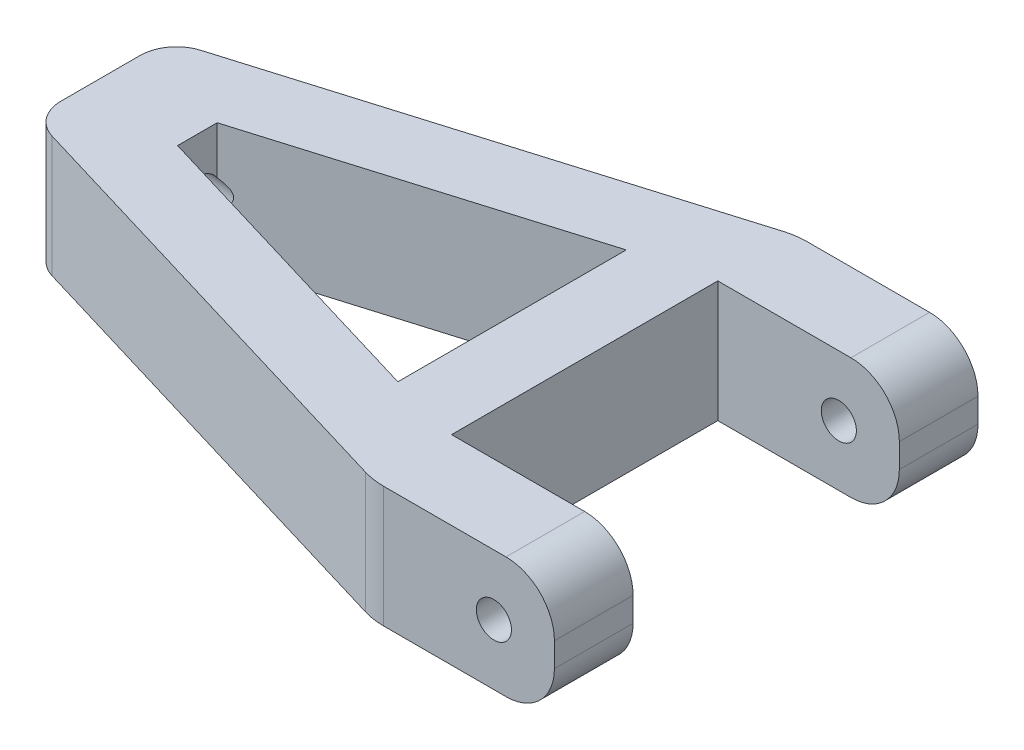
ISO-10303-21;
HEADER;
FILE_DESCRIPTION(('STEP AP214'),'2;1');
FILE_NAME('part.step','',(''),(''),'','','');
FILE_SCHEMA(('AUTOMOTIVE_DESIGN { 1 0 10303 214 1 1 1 1 }'));
ENDSEC;
DATA;
#1=APPLICATION_CONTEXT('core data for automotive mechanical design processes');
#2=APPLICATION_PROTOCOL_DEFINITION('international standard','automotive_design',2000,#1);
#3=PRODUCT_CONTEXT('',#1,'mechanical');
#4=PRODUCT('Part','Part','',(#3));
#5=PRODUCT_RELATED_PRODUCT_CATEGORY('part','',(#4));
#6=PRODUCT_DEFINITION_FORMATION('','',#4);
#7=PRODUCT_DEFINITION_CONTEXT('part definition',#1,'design');
#8=PRODUCT_DEFINITION('design','',#6,#7);
#9=PRODUCT_DEFINITION_SHAPE('','',#8);
#10=(LENGTH_UNIT() NAMED_UNIT(*) SI_UNIT(.MILLI.,.METRE.));
#11=(NAMED_UNIT(*) PLANE_ANGLE_UNIT() SI_UNIT($,.RADIAN.));
#12=(NAMED_UNIT(*) SI_UNIT($,.STERADIAN.) SOLID_ANGLE_UNIT());
#13=UNCERTAINTY_MEASURE_WITH_UNIT(LENGTH_MEASURE(1.E-05),#10,'distance_accuracy_value','');
#14=(GEOMETRIC_REPRESENTATION_CONTEXT(3) GLOBAL_UNCERTAINTY_ASSIGNED_CONTEXT((#13)) GLOBAL_UNIT_ASSIGNED_CONTEXT((#10,
#11,#12)) REPRESENTATION_CONTEXT('',''));
#15=CARTESIAN_POINT('',(0.,0.,0.));
#16=DIRECTION('',(0.,0.,1.));
#17=DIRECTION('',(1.,0.,0.));
#18=AXIS2_PLACEMENT_3D('',#15,#16,#17);
#19=CARTESIAN_POINT('',(55.,10.,0.));
#20=DIRECTION('',(-1.,0.,0.));
#21=DIRECTION('',(0.,0.,1.));
#22=AXIS2_PLACEMENT_3D('',#19,#20,#21);
#23=PLANE('',#22);
#24=DIRECTION('',(0.,-1.,0.));
#25=VECTOR('',#24,1.);
#26=CARTESIAN_POINT('',(55.,10.,28.5));
#27=LINE('',#26,#25);
#28=CARTESIAN_POINT('',(55.,6.,28.5));
#29=VERTEX_POINT('',#28);
#30=CARTESIAN_POINT('',(55.,4.,28.5));
#31=VERTEX_POINT('',#30);
#32=EDGE_CURVE('E229',#29,#31,#27,.T.);
#33=ORIENTED_EDGE('',*,*,#32,.F.);
#34=DIRECTION('',(0.,0.,-1.));
#35=VECTOR('',#34,1.);
#36=CARTESIAN_POINT('',(55.,6.,35.));
#37=LINE('',#36,#35);
#38=CARTESIAN_POINT('',(55.,6.,35.));
#39=VERTEX_POINT('',#38);
#40=EDGE_CURVE('E323',#29,#39,#37,.F.);
#41=ORIENTED_EDGE('',*,*,#40,.T.);
#42=DIRECTION('',(0.,-1.,0.));
#43=VECTOR('',#42,1.);
#44=CARTESIAN_POINT('',(55.,10.,35.));
#45=LINE('',#44,#43);
#46=CARTESIAN_POINT('',(55.,4.,35.));
#47=VERTEX_POINT('',#46);
#48=EDGE_CURVE('E303',#39,#47,#45,.T.);
#49=ORIENTED_EDGE('',*,*,#48,.T.);
#50=DIRECTION('',(0.,0.,-1.));
#51=VECTOR('',#50,1.);
#52=CARTESIAN_POINT('',(55.,4.,0.));
#53=LINE('',#52,#51);
#54=EDGE_CURVE('E320',#47,#31,#53,.T.);
#55=ORIENTED_EDGE('',*,*,#54,.T.);
#56=EDGE_LOOP('',(#33,#41,#49,#55));
#57=FACE_BOUND('',#56,.T.);
#58=ADVANCED_FACE('F33',(#57),#23,.F.);
#59=CARTESIAN_POINT('',(50.,5.,0.));
#60=DIRECTION('',(0.,0.,1.));
#61=DIRECTION('',(1.,0.,0.));
#62=AXIS2_PLACEMENT_3D('',#59,#60,#61);
#63=CYLINDRICAL_SURFACE('',#62,1.45);
#64=CARTESIAN_POINT('',(50.,5.,28.5));
#65=DIRECTION('',(0.,0.,1.));
#66=DIRECTION('',(1.,0.,0.));
#67=AXIS2_PLACEMENT_3D('',#64,#65,#66);
#68=CIRCLE('',#67,1.45);
#69=CARTESIAN_POINT('',(51.45,5.,28.5));
#70=VERTEX_POINT('',#69);
#71=EDGE_CURVE('E268',#70,#70,#68,.F.);
#72=ORIENTED_EDGE('',*,*,#71,.T.);
#73=EDGE_LOOP('',(#72));
#74=FACE_BOUND('',#73,.T.);
#75=CARTESIAN_POINT('',(50.,5.,35.));
#76=DIRECTION('',(0.,0.,1.));
#77=DIRECTION('',(1.,0.,0.));
#78=AXIS2_PLACEMENT_3D('',#75,#76,#77);
#79=CIRCLE('',#78,1.45);
#80=CARTESIAN_POINT('',(51.45,5.,35.));
#81=VERTEX_POINT('',#80);
#82=EDGE_CURVE('E267',#81,#81,#79,.T.);
#83=ORIENTED_EDGE('',*,*,#82,.T.);
#84=EDGE_LOOP('',(#83));
#85=FACE_BOUND('',#84,.T.);
#86=ADVANCED_FACE('F412',(#74,#85),#63,.F.);
#87=CARTESIAN_POINT('',(0.,10.,0.));
#88=DIRECTION('',(1.,0.,0.));
#89=DIRECTION('',(0.,0.,-1.));
#90=AXIS2_PLACEMENT_3D('',#87,#88,#89);
#91=PLANE('',#90);
#92=CARTESIAN_POINT('',(0.,5.,17.5));
#93=DIRECTION('',(-1.,0.,0.));
#94=DIRECTION('',(0.,0.,1.));
#95=AXIS2_PLACEMENT_3D('',#92,#93,#94);
#96=CIRCLE('',#95,1.95);
#97=CARTESIAN_POINT('',(0.,5.,19.45));
#98=VERTEX_POINT('',#97);
#99=EDGE_CURVE('E264',#98,#98,#96,.T.);
#100=ORIENTED_EDGE('',*,*,#99,.F.);
#101=EDGE_LOOP('',(#100));
#102=FACE_BOUND('',#101,.T.);
#103=DIRECTION('',(0.,0.,1.));
#104=VECTOR('',#103,1.);
#105=CARTESIAN_POINT('',(0.,10.,0.));
#106=LINE('',#105,#104);
#107=CARTESIAN_POINT('',(0.,10.,14.2320919526732));
#108=VERTEX_POINT('',#107);
#109=CARTESIAN_POINT('',(0.,10.,20.7679080473268));
#110=VERTEX_POINT('',#109);
#111=EDGE_CURVE('E285',#108,#110,#106,.T.);
#112=ORIENTED_EDGE('',*,*,#111,.F.);
#113=DIRECTION('',(0.,-1.,0.));
#114=VECTOR('',#113,1.);
#115=CARTESIAN_POINT('',(0.,10.,14.2320919526732));
#116=LINE('',#115,#114);
#117=CARTESIAN_POINT('',(0.,0.,14.2320919526732));
#118=VERTEX_POINT('',#117);
#119=EDGE_CURVE('E350',#108,#118,#116,.T.);
#120=ORIENTED_EDGE('',*,*,#119,.T.);
#121=DIRECTION('',(0.,0.,1.));
#122=VECTOR('',#121,1.);
#123=CARTESIAN_POINT('',(0.,0.,0.));
#124=LINE('',#123,#122);
#125=CARTESIAN_POINT('',(0.,0.,20.7679080473268));
#126=VERTEX_POINT('',#125);
#127=EDGE_CURVE('E283',#118,#126,#124,.T.);
#128=ORIENTED_EDGE('',*,*,#127,.T.);
#129=DIRECTION('',(0.,-1.,0.));
#130=VECTOR('',#129,1.);
#131=CARTESIAN_POINT('',(0.,10.,20.7679080473268));
#132=LINE('',#131,#130);
#133=EDGE_CURVE('E348',#126,#110,#132,.F.);
#134=ORIENTED_EDGE('',*,*,#133,.T.);
#135=EDGE_LOOP('',(#112,#120,#128,#134));
#136=FACE_BOUND('',#135,.T.);
#137=ADVANCED_FACE('F419',(#102,#136),#91,.F.);
#138=CARTESIAN_POINT('',(0.,10.,35.));
#139=DIRECTION('',(0.,0.,-1.));
#140=DIRECTION('',(-1.,0.,0.));
#141=AXIS2_PLACEMENT_3D('',#138,#139,#140);
#142=PLANE('',#141);
#143=ORIENTED_EDGE('',*,*,#82,.F.);
#144=EDGE_LOOP('',(#143));
#145=FACE_BOUND('',#144,.T.);
#146=DIRECTION('',(1.,0.,0.));
#147=VECTOR('',#146,1.);
#148=CARTESIAN_POINT('',(0.,10.,35.));
#149=LINE('',#148,#147);
#150=CARTESIAN_POINT('',(40.8806130178211,10.,35.));
#151=VERTEX_POINT('',#150);
#152=CARTESIAN_POINT('',(51.,10.,35.));
#153=VERTEX_POINT('',#152);
#154=EDGE_CURVE('E288',#151,#153,#149,.T.);
#155=ORIENTED_EDGE('',*,*,#154,.F.);
#156=DIRECTION('',(0.,-1.,0.));
#157=VECTOR('',#156,1.);
#158=CARTESIAN_POINT('',(40.8806130178211,10.,35.));
#159=LINE('',#158,#157);
#160=CARTESIAN_POINT('',(40.8806130178211,0.,35.));
#161=VERTEX_POINT('',#160);
#162=EDGE_CURVE('E368',#151,#161,#159,.T.);
#163=ORIENTED_EDGE('',*,*,#162,.T.);
#164=DIRECTION('',(1.,0.,0.));
#165=VECTOR('',#164,1.);
#166=CARTESIAN_POINT('',(0.,0.,35.));
#167=LINE('',#166,#165);
#168=CARTESIAN_POINT('',(51.,0.,35.));
#169=VERTEX_POINT('',#168);
#170=EDGE_CURVE('E297',#161,#169,#167,.T.);
#171=ORIENTED_EDGE('',*,*,#170,.T.);
#172=CARTESIAN_POINT('',(51.,4.,35.));
#173=DIRECTION('',(0.,0.,-1.));
#174=DIRECTION('',(-1.,0.,0.));
#175=AXIS2_PLACEMENT_3D('',#172,#173,#174);
#176=CIRCLE('',#175,4.);
#177=EDGE_CURVE('E325',#169,#47,#176,.F.);
#178=ORIENTED_EDGE('',*,*,#177,.T.);
#179=ORIENTED_EDGE('',*,*,#48,.F.);
#180=CARTESIAN_POINT('',(51.,6.,35.));
#181=DIRECTION('',(0.,0.,-1.));
#182=DIRECTION('',(-1.,0.,0.));
#183=AXIS2_PLACEMENT_3D('',#180,#181,#182);
#184=CIRCLE('',#183,4.);
#185=EDGE_CURVE('E327',#39,#153,#184,.F.);
#186=ORIENTED_EDGE('',*,*,#185,.T.);
#187=EDGE_LOOP('',(#155,#163,#171,#178,#179,#186));
#188=FACE_BOUND('',#187,.T.);
#189=ADVANCED_FACE('F428',(#145,#188),#142,.F.);
#190=DIRECTION('',(0.,-1.,0.));
#191=VECTOR('',#190,1.);
#192=CARTESIAN_POINT('',(55.,10.,0.));
#193=LINE('',#192,#191);
#194=CARTESIAN_POINT('',(55.,6.,0.));
#195=VERTEX_POINT('',#194);
#196=CARTESIAN_POINT('',(55.,4.,0.));
#197=VERTEX_POINT('',#196);
#198=EDGE_CURVE('E294',#195,#197,#193,.T.);
#199=ORIENTED_EDGE('',*,*,#198,.F.);
#200=DIRECTION('',(0.,0.,-1.));
#201=VECTOR('',#200,1.);
#202=CARTESIAN_POINT('',(55.,6.,6.5));
#203=LINE('',#202,#201);
#204=CARTESIAN_POINT('',(55.,6.,6.5));
#205=VERTEX_POINT('',#204);
#206=EDGE_CURVE('E342',#195,#205,#203,.F.);
#207=ORIENTED_EDGE('',*,*,#206,.T.);
#208=DIRECTION('',(0.,1.,0.));
#209=VECTOR('',#208,1.);
#210=CARTESIAN_POINT('',(55.,10.,6.5));
#211=LINE('',#210,#209);
#212=CARTESIAN_POINT('',(55.,4.,6.5));
#213=VERTEX_POINT('',#212);
#214=EDGE_CURVE('E238',#213,#205,#211,.T.);
#215=ORIENTED_EDGE('',*,*,#214,.F.);
#216=DIRECTION('',(0.,0.,-1.));
#217=VECTOR('',#216,1.);
#218=CARTESIAN_POINT('',(55.,4.,0.));
#219=LINE('',#218,#217);
#220=EDGE_CURVE('E339',#213,#197,#219,.T.);
#221=ORIENTED_EDGE('',*,*,#220,.T.);
#222=EDGE_LOOP('',(#199,#207,#215,#221));
#223=FACE_BOUND('',#222,.T.);
#224=ADVANCED_FACE('F415',(#223),#23,.F.);
#225=CARTESIAN_POINT('',(0.,10.,0.));
#226=DIRECTION('',(0.,0.,1.));
#227=DIRECTION('',(1.,0.,0.));
#228=AXIS2_PLACEMENT_3D('',#225,#226,#227);
#229=PLANE('',#228);
#230=CARTESIAN_POINT('',(50.,5.,0.));
#231=DIRECTION('',(0.,0.,1.));
#232=DIRECTION('',(1.,0.,0.));
#233=AXIS2_PLACEMENT_3D('',#230,#231,#232);
#234=CIRCLE('',#233,1.45);
#235=CARTESIAN_POINT('',(51.45,5.,0.));
#236=VERTEX_POINT('',#235);
#237=EDGE_CURVE('E269',#236,#236,#234,.T.);
#238=ORIENTED_EDGE('',*,*,#237,.T.);
#239=EDGE_LOOP('',(#238));
#240=FACE_BOUND('',#239,.T.);
#241=DIRECTION('',(-1.,0.,0.));
#242=VECTOR('',#241,1.);
#243=CARTESIAN_POINT('',(0.,0.,0.));
#244=LINE('',#243,#242);
#245=CARTESIAN_POINT('',(51.,0.,0.));
#246=VERTEX_POINT('',#245);
#247=CARTESIAN_POINT('',(40.8806130178211,0.,0.));
#248=VERTEX_POINT('',#247);
#249=EDGE_CURVE('E289',#246,#248,#244,.T.);
#250=ORIENTED_EDGE('',*,*,#249,.T.);
#251=DIRECTION('',(0.,-1.,0.));
#252=VECTOR('',#251,1.);
#253=CARTESIAN_POINT('',(40.8806130178211,10.,0.));
#254=LINE('',#253,#252);
#255=CARTESIAN_POINT('',(40.8806130178211,10.,0.));
#256=VERTEX_POINT('',#255);
#257=EDGE_CURVE('E384',#248,#256,#254,.F.);
#258=ORIENTED_EDGE('',*,*,#257,.T.);
#259=DIRECTION('',(-1.,0.,0.));
#260=VECTOR('',#259,1.);
#261=CARTESIAN_POINT('',(0.,10.,0.));
#262=LINE('',#261,#260);
#263=CARTESIAN_POINT('',(51.,10.,0.));
#264=VERTEX_POINT('',#263);
#265=EDGE_CURVE('E291',#264,#256,#262,.T.);
#266=ORIENTED_EDGE('',*,*,#265,.F.);
#267=CARTESIAN_POINT('',(51.,6.,0.));
#268=DIRECTION('',(0.,0.,1.));
#269=DIRECTION('',(1.,0.,0.));
#270=AXIS2_PLACEMENT_3D('',#267,#268,#269);
#271=CIRCLE('',#270,4.);
#272=EDGE_CURVE('E337',#264,#195,#271,.F.);
#273=ORIENTED_EDGE('',*,*,#272,.T.);
#274=ORIENTED_EDGE('',*,*,#198,.T.);
#275=CARTESIAN_POINT('',(51.,4.,0.));
#276=DIRECTION('',(0.,0.,1.));
#277=DIRECTION('',(1.,0.,0.));
#278=AXIS2_PLACEMENT_3D('',#275,#276,#277);
#279=CIRCLE('',#278,4.);
#280=EDGE_CURVE('E335',#197,#246,#279,.F.);
#281=ORIENTED_EDGE('',*,*,#280,.T.);
#282=EDGE_LOOP('',(#250,#258,#266,#273,#274,#281));
#283=FACE_BOUND('',#282,.T.);
#284=ADVANCED_FACE('F427',(#240,#283),#229,.F.);
#285=CARTESIAN_POINT('',(0.,10.,0.));
#286=DIRECTION('',(0.,1.,0.));
#287=DIRECTION('',(0.,0.,1.));
#288=AXIS2_PLACEMENT_3D('',#285,#286,#287);
#289=PLANE('',#288);
#290=DIRECTION('',(0.,0.,1.));
#291=VECTOR('',#290,1.);
#292=CARTESIAN_POINT('',(34.,10.,8.06418390534633));
#293=LINE('',#292,#291);
#294=CARTESIAN_POINT('',(34.,10.,8.06418390534633));
#295=VERTEX_POINT('',#294);
#296=CARTESIAN_POINT('',(34.,10.,26.9358160946537));
#297=VERTEX_POINT('',#296);
#298=EDGE_CURVE('E197',#295,#297,#293,.T.);
#299=ORIENTED_EDGE('',*,*,#298,.T.);
#300=DIRECTION('',(-0.957826285221151,0.,-0.287347885566345));
#301=VECTOR('',#300,1.);
#302=CARTESIAN_POINT('',(34.,10.,26.9358160946537));
#303=LINE('',#302,#301);
#304=CARTESIAN_POINT('',(8.,10.,19.1358160946537));
#305=VERTEX_POINT('',#304);
#306=EDGE_CURVE('E206',#297,#305,#303,.T.);
#307=ORIENTED_EDGE('',*,*,#306,.T.);
#308=DIRECTION('',(0.,0.,-1.));
#309=VECTOR('',#308,1.);
#310=CARTESIAN_POINT('',(8.,10.,19.1358160946537));
#311=LINE('',#310,#309);
#312=CARTESIAN_POINT('',(8.,10.,15.8641839053463));
#313=VERTEX_POINT('',#312);
#314=EDGE_CURVE('E48',#305,#313,#311,.T.);
#315=ORIENTED_EDGE('',*,*,#314,.T.);
#316=DIRECTION('',(0.957826285221151,0.,-0.287347885566345));
#317=VECTOR('',#316,1.);
#318=CARTESIAN_POINT('',(8.,10.,15.8641839053463));
#319=LINE('',#318,#317);
#320=EDGE_CURVE('E203',#313,#295,#319,.T.);
#321=ORIENTED_EDGE('',*,*,#320,.T.);
#322=EDGE_LOOP('',(#299,#307,#315,#321));
#323=FACE_BOUND('',#322,.T.);
#324=DIRECTION('',(0.957826285221151,0.,0.287347885566345));
#325=VECTOR('',#324,1.);
#326=CARTESIAN_POINT('',(0.,10.,23.));
#327=LINE('',#326,#325);
#328=CARTESIAN_POINT('',(2.13795634330097,10.,23.6413869029903));
#329=VERTEX_POINT('',#328);
#330=CARTESIAN_POINT('',(39.156525704423,10.,34.7469577113269));
#331=VERTEX_POINT('',#330);
#332=EDGE_CURVE('E275',#329,#331,#327,.T.);
#333=ORIENTED_EDGE('',*,*,#332,.T.);
#334=CARTESIAN_POINT('',(40.8806130178211,10.,29.));
#335=DIRECTION('',(0.,1.,0.));
#336=DIRECTION('',(0.,0.,1.));
#337=AXIS2_PLACEMENT_3D('',#334,#335,#336);
#338=CIRCLE('',#337,6.);
#339=EDGE_CURVE('E379',#331,#151,#338,.T.);
#340=ORIENTED_EDGE('',*,*,#339,.T.);
#341=ORIENTED_EDGE('',*,*,#154,.T.);
#342=DIRECTION('',(0.,0.,-1.));
#343=VECTOR('',#342,1.);
#344=CARTESIAN_POINT('',(51.,10.,28.5));
#345=LINE('',#344,#343);
#346=CARTESIAN_POINT('',(51.,10.,28.5));
#347=VERTEX_POINT('',#346);
#348=EDGE_CURVE('E313',#153,#347,#345,.T.);
#349=ORIENTED_EDGE('',*,*,#348,.T.);
#350=DIRECTION('',(1.,0.,0.));
#351=VECTOR('',#350,1.);
#352=CARTESIAN_POINT('',(40.,10.,28.5));
#353=LINE('',#352,#351);
#354=CARTESIAN_POINT('',(40.,10.,28.5));
#355=VERTEX_POINT('',#354);
#356=EDGE_CURVE('E252',#355,#347,#353,.T.);
#357=ORIENTED_EDGE('',*,*,#356,.F.);
#358=DIRECTION('',(0.,0.,1.));
#359=VECTOR('',#358,1.);
#360=CARTESIAN_POINT('',(40.,10.,28.5));
#361=LINE('',#360,#359);
#362=CARTESIAN_POINT('',(40.,10.,6.5));
#363=VERTEX_POINT('',#362);
#364=EDGE_CURVE('E244',#363,#355,#361,.T.);
#365=ORIENTED_EDGE('',*,*,#364,.F.);
#366=DIRECTION('',(1.,0.,0.));
#367=VECTOR('',#366,1.);
#368=CARTESIAN_POINT('',(40.,10.,6.5));
#369=LINE('',#368,#367);
#370=CARTESIAN_POINT('',(51.,10.,6.5));
#371=VERTEX_POINT('',#370);
#372=EDGE_CURVE('E256',#363,#371,#369,.T.);
#373=ORIENTED_EDGE('',*,*,#372,.T.);
#374=DIRECTION('',(0.,0.,-1.));
#375=VECTOR('',#374,1.);
#376=CARTESIAN_POINT('',(51.,10.,0.));
#377=LINE('',#376,#375);
#378=EDGE_CURVE('E306',#371,#264,#377,.T.);
#379=ORIENTED_EDGE('',*,*,#378,.T.);
#380=ORIENTED_EDGE('',*,*,#265,.T.);
#381=CARTESIAN_POINT('',(40.8806130178211,10.,6.));
#382=DIRECTION('',(0.,1.,0.));
#383=DIRECTION('',(0.,0.,1.));
#384=AXIS2_PLACEMENT_3D('',#381,#382,#383);
#385=CIRCLE('',#384,6.);
#386=CARTESIAN_POINT('',(39.156525704423,10.,0.253042288673093));
#387=VERTEX_POINT('',#386);
#388=EDGE_CURVE('E377',#256,#387,#385,.T.);
#389=ORIENTED_EDGE('',*,*,#388,.T.);
#390=DIRECTION('',(-0.957826285221151,0.,0.287347885566345));
#391=VECTOR('',#390,1.);
#392=CARTESIAN_POINT('',(0.,10.,12.));
#393=LINE('',#392,#391);
#394=CARTESIAN_POINT('',(2.13795634330097,10.,11.3586130970097));
#395=VERTEX_POINT('',#394);
#396=EDGE_CURVE('E281',#387,#395,#393,.T.);
#397=ORIENTED_EDGE('',*,*,#396,.T.);
#398=CARTESIAN_POINT('',(3.,10.,14.2320919526732));
#399=DIRECTION('',(0.,1.,0.));
#400=DIRECTION('',(0.,0.,1.));
#401=AXIS2_PLACEMENT_3D('',#398,#399,#400);
#402=CIRCLE('',#401,3.);
#403=EDGE_CURVE('E363',#395,#108,#402,.T.);
#404=ORIENTED_EDGE('',*,*,#403,.T.);
#405=ORIENTED_EDGE('',*,*,#111,.T.);
#406=CARTESIAN_POINT('',(3.,10.,20.7679080473268));
#407=DIRECTION('',(0.,1.,0.));
#408=DIRECTION('',(0.,0.,1.));
#409=AXIS2_PLACEMENT_3D('',#406,#407,#408);
#410=CIRCLE('',#409,3.);
#411=EDGE_CURVE('E361',#110,#329,#410,.T.);
#412=ORIENTED_EDGE('',*,*,#411,.T.);
#413=EDGE_LOOP('',(#333,#340,#341,#349,#357,#365,#373,#379,#380,#389,#397,#404,#405,#412));
#414=FACE_BOUND('',#413,.T.);
#415=ADVANCED_FACE('F211',(#323,#414),#289,.T.);
#416=CARTESIAN_POINT('',(0.,0.,0.));
#417=DIRECTION('',(0.,1.,0.));
#418=DIRECTION('',(0.,0.,1.));
#419=AXIS2_PLACEMENT_3D('',#416,#417,#418);
#420=PLANE('',#419);
#421=DIRECTION('',(-0.957826285221151,0.,-0.287347885566345));
#422=VECTOR('',#421,1.);
#423=CARTESIAN_POINT('',(34.,0.,26.9358160946537));
#424=LINE('',#423,#422);
#425=CARTESIAN_POINT('',(34.,0.,26.9358160946537));
#426=VERTEX_POINT('',#425);
#427=CARTESIAN_POINT('',(8.,0.,19.1358160946537));
#428=VERTEX_POINT('',#427);
#429=EDGE_CURVE('E223',#426,#428,#424,.T.);
#430=ORIENTED_EDGE('',*,*,#429,.F.);
#431=DIRECTION('',(0.,0.,1.));
#432=VECTOR('',#431,1.);
#433=CARTESIAN_POINT('',(34.,0.,8.06418390534633));
#434=LINE('',#433,#432);
#435=CARTESIAN_POINT('',(34.,0.,8.06418390534633));
#436=VERTEX_POINT('',#435);
#437=EDGE_CURVE('E56',#436,#426,#434,.T.);
#438=ORIENTED_EDGE('',*,*,#437,.F.);
#439=DIRECTION('',(0.957826285221151,0.,-0.287347885566345));
#440=VECTOR('',#439,1.);
#441=CARTESIAN_POINT('',(8.,0.,15.8641839053463));
#442=LINE('',#441,#440);
#443=CARTESIAN_POINT('',(8.,0.,15.8641839053463));
#444=VERTEX_POINT('',#443);
#445=EDGE_CURVE('E214',#444,#436,#442,.T.);
#446=ORIENTED_EDGE('',*,*,#445,.F.);
#447=DIRECTION('',(0.,0.,-1.));
#448=VECTOR('',#447,1.);
#449=CARTESIAN_POINT('',(8.,0.,19.1358160946537));
#450=LINE('',#449,#448);
#451=EDGE_CURVE('E217',#428,#444,#450,.T.);
#452=ORIENTED_EDGE('',*,*,#451,.F.);
#453=EDGE_LOOP('',(#430,#438,#446,#452));
#454=FACE_BOUND('',#453,.T.);
#455=ORIENTED_EDGE('',*,*,#170,.F.);
#456=CARTESIAN_POINT('',(40.8806130178211,0.,29.));
#457=DIRECTION('',(0.,1.,0.));
#458=DIRECTION('',(0.,0.,1.));
#459=AXIS2_PLACEMENT_3D('',#456,#457,#458);
#460=CIRCLE('',#459,6.);
#461=CARTESIAN_POINT('',(39.156525704423,0.,34.7469577113269));
#462=VERTEX_POINT('',#461);
#463=EDGE_CURVE('E373',#161,#462,#460,.F.);
#464=ORIENTED_EDGE('',*,*,#463,.T.);
#465=DIRECTION('',(0.957826285221151,0.,0.287347885566345));
#466=VECTOR('',#465,1.);
#467=CARTESIAN_POINT('',(0.,0.,23.));
#468=LINE('',#467,#466);
#469=CARTESIAN_POINT('',(2.13795634330097,0.,23.6413869029903));
#470=VERTEX_POINT('',#469);
#471=EDGE_CURVE('E272',#470,#462,#468,.T.);
#472=ORIENTED_EDGE('',*,*,#471,.F.);
#473=CARTESIAN_POINT('',(3.,0.,20.7679080473268));
#474=DIRECTION('',(0.,1.,0.));
#475=DIRECTION('',(0.,0.,1.));
#476=AXIS2_PLACEMENT_3D('',#473,#474,#475);
#477=CIRCLE('',#476,3.);
#478=EDGE_CURVE('E353',#470,#126,#477,.F.);
#479=ORIENTED_EDGE('',*,*,#478,.T.);
#480=ORIENTED_EDGE('',*,*,#127,.F.);
#481=CARTESIAN_POINT('',(3.,0.,14.2320919526732));
#482=DIRECTION('',(0.,1.,0.));
#483=DIRECTION('',(0.,0.,1.));
#484=AXIS2_PLACEMENT_3D('',#481,#482,#483);
#485=CIRCLE('',#484,3.);
#486=CARTESIAN_POINT('',(2.13795634330097,0.,11.3586130970097));
#487=VERTEX_POINT('',#486);
#488=EDGE_CURVE('E355',#118,#487,#485,.F.);
#489=ORIENTED_EDGE('',*,*,#488,.T.);
#490=DIRECTION('',(-0.957826285221151,0.,0.287347885566345));
#491=VECTOR('',#490,1.);
#492=CARTESIAN_POINT('',(0.,0.,12.));
#493=LINE('',#492,#491);
#494=CARTESIAN_POINT('',(39.156525704423,0.,0.253042288673093));
#495=VERTEX_POINT('',#494);
#496=EDGE_CURVE('E278',#495,#487,#493,.T.);
#497=ORIENTED_EDGE('',*,*,#496,.F.);
#498=CARTESIAN_POINT('',(40.8806130178211,0.,6.));
#499=DIRECTION('',(0.,1.,0.));
#500=DIRECTION('',(0.,0.,1.));
#501=AXIS2_PLACEMENT_3D('',#498,#499,#500);
#502=CIRCLE('',#501,6.);
#503=EDGE_CURVE('E371',#495,#248,#502,.F.);
#504=ORIENTED_EDGE('',*,*,#503,.T.);
#505=ORIENTED_EDGE('',*,*,#249,.F.);
#506=DIRECTION('',(0.,0.,-1.));
#507=VECTOR('',#506,1.);
#508=CARTESIAN_POINT('',(51.,0.,0.));
#509=LINE('',#508,#507);
#510=CARTESIAN_POINT('',(51.,0.,6.5));
#511=VERTEX_POINT('',#510);
#512=EDGE_CURVE('E330',#246,#511,#509,.F.);
#513=ORIENTED_EDGE('',*,*,#512,.T.);
#514=DIRECTION('',(1.,0.,0.));
#515=VECTOR('',#514,1.);
#516=CARTESIAN_POINT('',(40.,0.,6.5));
#517=LINE('',#516,#515);
#518=CARTESIAN_POINT('',(40.,0.,6.5));
#519=VERTEX_POINT('',#518);
#520=EDGE_CURVE('E259',#519,#511,#517,.T.);
#521=ORIENTED_EDGE('',*,*,#520,.F.);
#522=DIRECTION('',(0.,0.,-1.));
#523=VECTOR('',#522,1.);
#524=CARTESIAN_POINT('',(40.,0.,28.5));
#525=LINE('',#524,#523);
#526=CARTESIAN_POINT('',(40.,0.,28.5));
#527=VERTEX_POINT('',#526);
#528=EDGE_CURVE('E237',#527,#519,#525,.T.);
#529=ORIENTED_EDGE('',*,*,#528,.F.);
#530=DIRECTION('',(1.,0.,0.));
#531=VECTOR('',#530,1.);
#532=CARTESIAN_POINT('',(40.,0.,28.5));
#533=LINE('',#532,#531);
#534=CARTESIAN_POINT('',(51.,0.,28.5));
#535=VERTEX_POINT('',#534);
#536=EDGE_CURVE('E247',#527,#535,#533,.T.);
#537=ORIENTED_EDGE('',*,*,#536,.T.);
#538=DIRECTION('',(0.,0.,-1.));
#539=VECTOR('',#538,1.);
#540=CARTESIAN_POINT('',(51.,0.,0.));
#541=LINE('',#540,#539);
#542=EDGE_CURVE('E332',#535,#169,#541,.F.);
#543=ORIENTED_EDGE('',*,*,#542,.T.);
#544=EDGE_LOOP('',(#455,#464,#472,#479,#480,#489,#497,#504,#505,#513,#521,#529,#537,#543));
#545=FACE_BOUND('',#544,.T.);
#546=ADVANCED_FACE('F464',(#454,#545),#420,.F.);
#547=CARTESIAN_POINT('',(0.,10.,12.));
#548=DIRECTION('',(0.287347885566345,0.,0.957826285221151));
#549=DIRECTION('',(0.957826285221151,0.,-0.287347885566345));
#550=AXIS2_PLACEMENT_3D('',#547,#548,#549);
#551=PLANE('',#550);
#552=ORIENTED_EDGE('',*,*,#396,.F.);
#553=DIRECTION('',(0.,-1.,0.));
#554=VECTOR('',#553,1.);
#555=CARTESIAN_POINT('',(39.156525704423,10.,0.253042288673091));
#556=LINE('',#555,#554);
#557=EDGE_CURVE('E381',#387,#495,#556,.T.);
#558=ORIENTED_EDGE('',*,*,#557,.T.);
#559=ORIENTED_EDGE('',*,*,#496,.T.);
#560=DIRECTION('',(0.,-1.,0.));
#561=VECTOR('',#560,1.);
#562=CARTESIAN_POINT('',(2.13795634330097,10.,11.3586130970097));
#563=LINE('',#562,#561);
#564=EDGE_CURVE('E358',#487,#395,#563,.F.);
#565=ORIENTED_EDGE('',*,*,#564,.T.);
#566=EDGE_LOOP('',(#552,#558,#559,#565));
#567=FACE_BOUND('',#566,.T.);
#568=ADVANCED_FACE('F471',(#567),#551,.F.);
#569=CARTESIAN_POINT('',(0.,10.,23.));
#570=DIRECTION('',(0.287347885566345,0.,-0.957826285221151));
#571=DIRECTION('',(-0.957826285221151,0.,-0.287347885566345));
#572=AXIS2_PLACEMENT_3D('',#569,#570,#571);
#573=PLANE('',#572);
#574=ORIENTED_EDGE('',*,*,#471,.T.);
#575=DIRECTION('',(0.,-1.,0.));
#576=VECTOR('',#575,1.);
#577=CARTESIAN_POINT('',(39.156525704423,10.,34.7469577113269));
#578=LINE('',#577,#576);
#579=EDGE_CURVE('E375',#462,#331,#578,.F.);
#580=ORIENTED_EDGE('',*,*,#579,.T.);
#581=ORIENTED_EDGE('',*,*,#332,.F.);
#582=DIRECTION('',(0.,-1.,0.));
#583=VECTOR('',#582,1.);
#584=CARTESIAN_POINT('',(2.13795634330097,10.,23.6413869029903));
#585=LINE('',#584,#583);
#586=EDGE_CURVE('E365',#329,#470,#585,.T.);
#587=ORIENTED_EDGE('',*,*,#586,.T.);
#588=EDGE_LOOP('',(#574,#580,#581,#587));
#589=FACE_BOUND('',#588,.T.);
#590=ADVANCED_FACE('F489',(#589),#573,.F.);
#591=CARTESIAN_POINT('',(50.,5.,6.5));
#592=DIRECTION('',(0.,0.,-1.));
#593=DIRECTION('',(0.,1.,0.));
#594=AXIS2_PLACEMENT_3D('',#591,#592,#593);
#595=CIRCLE('',#594,1.45);
#596=CARTESIAN_POINT('',(50.,6.45,6.5));
#597=VERTEX_POINT('',#596);
#598=EDGE_CURVE('E255',#597,#597,#595,.F.);
#599=ORIENTED_EDGE('',*,*,#598,.T.);
#600=EDGE_LOOP('',(#599));
#601=FACE_BOUND('',#600,.T.);
#602=ORIENTED_EDGE('',*,*,#237,.F.);
#603=EDGE_LOOP('',(#602));
#604=FACE_BOUND('',#603,.T.);
#605=ADVANCED_FACE('F422',(#601,#604),#63,.F.);
#606=CARTESIAN_POINT('',(11.,5.,17.5));
#607=DIRECTION('',(-1.,0.,0.));
#608=DIRECTION('',(0.,0.,1.));
#609=AXIS2_PLACEMENT_3D('',#606,#607,#608);
#610=CYLINDRICAL_SURFACE('',#609,1.95);
#611=CARTESIAN_POINT('',(8.,5.,17.5));
#612=DIRECTION('',(-1.,0.,0.));
#613=DIRECTION('',(0.,0.,1.));
#614=AXIS2_PLACEMENT_3D('',#611,#612,#613);
#615=CIRCLE('',#614,1.95);
#616=CARTESIAN_POINT('',(8.,3.9385831617729,19.1358160946537));
#617=VERTEX_POINT('',#616);
#618=CARTESIAN_POINT('',(8.,3.9385831617729,15.8641839053463));
#619=VERTEX_POINT('',#618);
#620=EDGE_CURVE('E41',#617,#619,#615,.F.);
#621=ORIENTED_EDGE('',*,*,#620,.T.);
#622=CARTESIAN_POINT('',(2.54727968448776,5.,17.5));
#623=DIRECTION('',(-0.287347885566345,0.,-0.957826285221151));
#624=DIRECTION('',(-0.957826285221151,0.,0.287347885566345));
#625=AXIS2_PLACEMENT_3D('',#622,#623,#624);
#626=ELLIPSE('',#625,6.78619923079186,1.95);
#627=CARTESIAN_POINT('',(8.,6.0614168382271,15.8641839053463));
#628=VERTEX_POINT('',#627);
#629=EDGE_CURVE('E11',#619,#628,#626,.F.);
#630=ORIENTED_EDGE('',*,*,#629,.T.);
#631=CARTESIAN_POINT('',(8.,6.0614168382271,19.1358160946537));
#632=VERTEX_POINT('',#631);
#633=EDGE_CURVE('E388',#628,#632,#615,.F.);
#634=ORIENTED_EDGE('',*,*,#633,.T.);
#635=CARTESIAN_POINT('',(2.54727968448777,5.,17.5));
#636=DIRECTION('',(-0.287347885566345,0.,0.957826285221151));
#637=DIRECTION('',(-0.957826285221151,0.,-0.287347885566345));
#638=AXIS2_PLACEMENT_3D('',#635,#636,#637);
#639=ELLIPSE('',#638,6.78619923079185,1.95);
#640=EDGE_CURVE('E386',#632,#617,#639,.F.);
#641=ORIENTED_EDGE('',*,*,#640,.T.);
#642=EDGE_LOOP('',(#621,#630,#634,#641));
#643=FACE_BOUND('',#642,.T.);
#644=ORIENTED_EDGE('',*,*,#99,.T.);
#645=EDGE_LOOP('',(#644));
#646=FACE_BOUND('',#645,.T.);
#647=ADVANCED_FACE('F393',(#643,#646),#610,.F.);
#648=CARTESIAN_POINT('',(40.,10.,28.5));
#649=DIRECTION('',(0.,0.,1.));
#650=DIRECTION('',(1.,0.,0.));
#651=AXIS2_PLACEMENT_3D('',#648,#649,#650);
#652=PLANE('',#651);
#653=ORIENTED_EDGE('',*,*,#356,.T.);
#654=CARTESIAN_POINT('',(51.,6.,28.5));
#655=DIRECTION('',(0.,0.,1.));
#656=DIRECTION('',(1.,0.,0.));
#657=AXIS2_PLACEMENT_3D('',#654,#655,#656);
#658=CIRCLE('',#657,4.);
#659=EDGE_CURVE('E318',#347,#29,#658,.F.);
#660=ORIENTED_EDGE('',*,*,#659,.T.);
#661=ORIENTED_EDGE('',*,*,#32,.T.);
#662=CARTESIAN_POINT('',(51.,4.,28.5));
#663=DIRECTION('',(0.,0.,1.));
#664=DIRECTION('',(1.,0.,0.));
#665=AXIS2_PLACEMENT_3D('',#662,#663,#664);
#666=CIRCLE('',#665,4.);
#667=EDGE_CURVE('E316',#31,#535,#666,.F.);
#668=ORIENTED_EDGE('',*,*,#667,.T.);
#669=ORIENTED_EDGE('',*,*,#536,.F.);
#670=DIRECTION('',(0.,-1.,0.));
#671=VECTOR('',#670,1.);
#672=CARTESIAN_POINT('',(40.,10.,28.5));
#673=LINE('',#672,#671);
#674=EDGE_CURVE('E235',#355,#527,#673,.T.);
#675=ORIENTED_EDGE('',*,*,#674,.F.);
#676=EDGE_LOOP('',(#653,#660,#661,#668,#669,#675));
#677=FACE_BOUND('',#676,.T.);
#678=ORIENTED_EDGE('',*,*,#71,.F.);
#679=EDGE_LOOP('',(#678));
#680=FACE_BOUND('',#679,.T.);
#681=ADVANCED_FACE('F503',(#677,#680),#652,.F.);
#682=CARTESIAN_POINT('',(40.,10.,6.5));
#683=DIRECTION('',(0.,0.,-1.));
#684=DIRECTION('',(0.,1.,0.));
#685=AXIS2_PLACEMENT_3D('',#682,#683,#684);
#686=PLANE('',#685);
#687=ORIENTED_EDGE('',*,*,#214,.T.);
#688=CARTESIAN_POINT('',(51.,6.,6.5));
#689=DIRECTION('',(0.,0.,-1.));
#690=DIRECTION('',(0.,1.,0.));
#691=AXIS2_PLACEMENT_3D('',#688,#689,#690);
#692=CIRCLE('',#691,4.);
#693=EDGE_CURVE('E346',#205,#371,#692,.F.);
#694=ORIENTED_EDGE('',*,*,#693,.T.);
#695=ORIENTED_EDGE('',*,*,#372,.F.);
#696=DIRECTION('',(0.,1.,0.));
#697=VECTOR('',#696,1.);
#698=CARTESIAN_POINT('',(40.,10.,6.5));
#699=LINE('',#698,#697);
#700=EDGE_CURVE('E241',#519,#363,#699,.T.);
#701=ORIENTED_EDGE('',*,*,#700,.F.);
#702=ORIENTED_EDGE('',*,*,#520,.T.);
#703=CARTESIAN_POINT('',(51.,4.,6.5));
#704=DIRECTION('',(0.,0.,-1.));
#705=DIRECTION('',(0.,1.,0.));
#706=AXIS2_PLACEMENT_3D('',#703,#704,#705);
#707=CIRCLE('',#706,4.);
#708=EDGE_CURVE('E344',#511,#213,#707,.F.);
#709=ORIENTED_EDGE('',*,*,#708,.T.);
#710=EDGE_LOOP('',(#687,#694,#695,#701,#702,#709));
#711=FACE_BOUND('',#710,.T.);
#712=ORIENTED_EDGE('',*,*,#598,.F.);
#713=EDGE_LOOP('',(#712));
#714=FACE_BOUND('',#713,.T.);
#715=ADVANCED_FACE('F446',(#711,#714),#686,.F.);
#716=CARTESIAN_POINT('',(40.,0.,0.));
#717=DIRECTION('',(1.,0.,0.));
#718=DIRECTION('',(0.,0.,-1.));
#719=AXIS2_PLACEMENT_3D('',#716,#717,#718);
#720=PLANE('',#719);
#721=ORIENTED_EDGE('',*,*,#674,.T.);
#722=ORIENTED_EDGE('',*,*,#528,.T.);
#723=ORIENTED_EDGE('',*,*,#700,.T.);
#724=ORIENTED_EDGE('',*,*,#364,.T.);
#725=EDGE_LOOP('',(#721,#722,#723,#724));
#726=FACE_BOUND('',#725,.T.);
#727=ADVANCED_FACE('F452',(#726),#720,.T.);
#728=CARTESIAN_POINT('',(51.,6.,0.));
#729=DIRECTION('',(0.,0.,1.));
#730=DIRECTION('',(1.,0.,0.));
#731=AXIS2_PLACEMENT_3D('',#728,#729,#730);
#732=CYLINDRICAL_SURFACE('',#731,4.);
#733=ORIENTED_EDGE('',*,*,#185,.F.);
#734=ORIENTED_EDGE('',*,*,#40,.F.);
#735=ORIENTED_EDGE('',*,*,#659,.F.);
#736=ORIENTED_EDGE('',*,*,#348,.F.);
#737=EDGE_LOOP('',(#733,#734,#735,#736));
#738=FACE_BOUND('',#737,.T.);
#739=ADVANCED_FACE('F501',(#738),#732,.T.);
#740=CARTESIAN_POINT('',(51.,4.,0.));
#741=DIRECTION('',(0.,0.,-1.));
#742=DIRECTION('',(-1.,0.,0.));
#743=AXIS2_PLACEMENT_3D('',#740,#741,#742);
#744=CYLINDRICAL_SURFACE('',#743,4.);
#745=ORIENTED_EDGE('',*,*,#177,.F.);
#746=ORIENTED_EDGE('',*,*,#542,.F.);
#747=ORIENTED_EDGE('',*,*,#667,.F.);
#748=ORIENTED_EDGE('',*,*,#54,.F.);
#749=EDGE_LOOP('',(#745,#746,#747,#748));
#750=FACE_BOUND('',#749,.T.);
#751=ADVANCED_FACE('F508',(#750),#744,.T.);
#752=CARTESIAN_POINT('',(51.,6.,0.));
#753=DIRECTION('',(0.,0.,1.));
#754=DIRECTION('',(1.,0.,0.));
#755=AXIS2_PLACEMENT_3D('',#752,#753,#754);
#756=CYLINDRICAL_SURFACE('',#755,4.);
#757=ORIENTED_EDGE('',*,*,#693,.F.);
#758=ORIENTED_EDGE('',*,*,#206,.F.);
#759=ORIENTED_EDGE('',*,*,#272,.F.);
#760=ORIENTED_EDGE('',*,*,#378,.F.);
#761=EDGE_LOOP('',(#757,#758,#759,#760));
#762=FACE_BOUND('',#761,.T.);
#763=ADVANCED_FACE('F443',(#762),#756,.T.);
#764=CARTESIAN_POINT('',(51.,4.,0.));
#765=DIRECTION('',(0.,0.,-1.));
#766=DIRECTION('',(-1.,0.,0.));
#767=AXIS2_PLACEMENT_3D('',#764,#765,#766);
#768=CYLINDRICAL_SURFACE('',#767,4.);
#769=ORIENTED_EDGE('',*,*,#708,.F.);
#770=ORIENTED_EDGE('',*,*,#512,.F.);
#771=ORIENTED_EDGE('',*,*,#280,.F.);
#772=ORIENTED_EDGE('',*,*,#220,.F.);
#773=EDGE_LOOP('',(#769,#770,#771,#772));
#774=FACE_BOUND('',#773,.T.);
#775=ADVANCED_FACE('F460',(#774),#768,.T.);
#776=CARTESIAN_POINT('',(3.,10.,14.2320919526732));
#777=DIRECTION('',(0.,-1.,0.));
#778=DIRECTION('',(0.,0.,-1.));
#779=AXIS2_PLACEMENT_3D('',#776,#777,#778);
#780=CYLINDRICAL_SURFACE('',#779,3.);
#781=ORIENTED_EDGE('',*,*,#403,.F.);
#782=ORIENTED_EDGE('',*,*,#564,.F.);
#783=ORIENTED_EDGE('',*,*,#488,.F.);
#784=ORIENTED_EDGE('',*,*,#119,.F.);
#785=EDGE_LOOP('',(#781,#782,#783,#784));
#786=FACE_BOUND('',#785,.T.);
#787=ADVANCED_FACE('F481',(#786),#780,.T.);
#788=CARTESIAN_POINT('',(3.,10.,20.7679080473268));
#789=DIRECTION('',(0.,-1.,0.));
#790=DIRECTION('',(0.,0.,-1.));
#791=AXIS2_PLACEMENT_3D('',#788,#789,#790);
#792=CYLINDRICAL_SURFACE('',#791,3.);
#793=ORIENTED_EDGE('',*,*,#411,.F.);
#794=ORIENTED_EDGE('',*,*,#133,.F.);
#795=ORIENTED_EDGE('',*,*,#478,.F.);
#796=ORIENTED_EDGE('',*,*,#586,.F.);
#797=EDGE_LOOP('',(#793,#794,#795,#796));
#798=FACE_BOUND('',#797,.T.);
#799=ADVANCED_FACE('F484',(#798),#792,.T.);
#800=CARTESIAN_POINT('',(40.8806130178211,10.,29.));
#801=DIRECTION('',(0.,-1.,0.));
#802=DIRECTION('',(0.,0.,-1.));
#803=AXIS2_PLACEMENT_3D('',#800,#801,#802);
#804=CYLINDRICAL_SURFACE('',#803,6.);
#805=ORIENTED_EDGE('',*,*,#339,.F.);
#806=ORIENTED_EDGE('',*,*,#579,.F.);
#807=ORIENTED_EDGE('',*,*,#463,.F.);
#808=ORIENTED_EDGE('',*,*,#162,.F.);
#809=EDGE_LOOP('',(#805,#806,#807,#808));
#810=FACE_BOUND('',#809,.T.);
#811=ADVANCED_FACE('F492',(#810),#804,.T.);
#812=CARTESIAN_POINT('',(40.8806130178211,10.,6.));
#813=DIRECTION('',(0.,-1.,0.));
#814=DIRECTION('',(0.,0.,-1.));
#815=AXIS2_PLACEMENT_3D('',#812,#813,#814);
#816=CYLINDRICAL_SURFACE('',#815,6.);
#817=ORIENTED_EDGE('',*,*,#388,.F.);
#818=ORIENTED_EDGE('',*,*,#257,.F.);
#819=ORIENTED_EDGE('',*,*,#503,.F.);
#820=ORIENTED_EDGE('',*,*,#557,.F.);
#821=EDGE_LOOP('',(#817,#818,#819,#820));
#822=FACE_BOUND('',#821,.T.);
#823=ADVANCED_FACE('F35',(#822),#816,.T.);
#824=CARTESIAN_POINT('',(8.,10.,15.8641839053463));
#825=DIRECTION('',(-0.287347885566345,0.,-0.957826285221151));
#826=DIRECTION('',(-0.957826285221151,0.,0.287347885566345));
#827=AXIS2_PLACEMENT_3D('',#824,#825,#826);
#828=PLANE('',#827);
#829=DIRECTION('',(0.,-1.,0.));
#830=VECTOR('',#829,1.);
#831=CARTESIAN_POINT('',(8.,10.,15.8641839053463));
#832=LINE('',#831,#830);
#833=EDGE_CURVE('E233',#619,#444,#832,.T.);
#834=ORIENTED_EDGE('',*,*,#833,.T.);
#835=ORIENTED_EDGE('',*,*,#445,.T.);
#836=DIRECTION('',(0.,-1.,0.));
#837=VECTOR('',#836,1.);
#838=CARTESIAN_POINT('',(34.,10.,8.06418390534633));
#839=LINE('',#838,#837);
#840=EDGE_CURVE('E227',#295,#436,#839,.T.);
#841=ORIENTED_EDGE('',*,*,#840,.F.);
#842=ORIENTED_EDGE('',*,*,#320,.F.);
#843=EDGE_CURVE('E230',#313,#628,#832,.T.);
#844=ORIENTED_EDGE('',*,*,#843,.T.);
#845=ORIENTED_EDGE('',*,*,#629,.F.);
#846=EDGE_LOOP('',(#834,#835,#841,#842,#844,#845));
#847=FACE_BOUND('',#846,.T.);
#848=ADVANCED_FACE('F401',(#847),#828,.F.);
#849=CARTESIAN_POINT('',(8.,10.,19.1358160946537));
#850=DIRECTION('',(-1.,0.,0.));
#851=DIRECTION('',(0.,0.,1.));
#852=AXIS2_PLACEMENT_3D('',#849,#850,#851);
#853=PLANE('',#852);
#854=DIRECTION('',(0.,-1.,0.));
#855=VECTOR('',#854,1.);
#856=CARTESIAN_POINT('',(8.,10.,19.1358160946537));
#857=LINE('',#856,#855);
#858=EDGE_CURVE('E202',#617,#428,#857,.T.);
#859=ORIENTED_EDGE('',*,*,#858,.T.);
#860=ORIENTED_EDGE('',*,*,#451,.T.);
#861=ORIENTED_EDGE('',*,*,#833,.F.);
#862=ORIENTED_EDGE('',*,*,#620,.F.);
#863=EDGE_LOOP('',(#859,#860,#861,#862));
#864=FACE_BOUND('',#863,.T.);
#865=ADVANCED_FACE('F397',(#864),#853,.F.);
#866=ORIENTED_EDGE('',*,*,#843,.F.);
#867=ORIENTED_EDGE('',*,*,#314,.F.);
#868=EDGE_CURVE('E208',#305,#632,#857,.T.);
#869=ORIENTED_EDGE('',*,*,#868,.T.);
#870=ORIENTED_EDGE('',*,*,#633,.F.);
#871=EDGE_LOOP('',(#866,#867,#869,#870));
#872=FACE_BOUND('',#871,.T.);
#873=ADVANCED_FACE('F402',(#872),#853,.F.);
#874=CARTESIAN_POINT('',(34.,10.,26.9358160946537));
#875=DIRECTION('',(-0.287347885566345,0.,0.957826285221151));
#876=DIRECTION('',(0.957826285221151,0.,0.287347885566345));
#877=AXIS2_PLACEMENT_3D('',#874,#875,#876);
#878=PLANE('',#877);
#879=ORIENTED_EDGE('',*,*,#868,.F.);
#880=ORIENTED_EDGE('',*,*,#306,.F.);
#881=DIRECTION('',(0.,-1.,0.));
#882=VECTOR('',#881,1.);
#883=CARTESIAN_POINT('',(34.,10.,26.9358160946537));
#884=LINE('',#883,#882);
#885=EDGE_CURVE('E193',#297,#426,#884,.T.);
#886=ORIENTED_EDGE('',*,*,#885,.T.);
#887=ORIENTED_EDGE('',*,*,#429,.T.);
#888=ORIENTED_EDGE('',*,*,#858,.F.);
#889=ORIENTED_EDGE('',*,*,#640,.F.);
#890=EDGE_LOOP('',(#879,#880,#886,#887,#888,#889));
#891=FACE_BOUND('',#890,.T.);
#892=ADVANCED_FACE('F207',(#891),#878,.F.);
#893=CARTESIAN_POINT('',(34.,10.,8.06418390534633));
#894=DIRECTION('',(1.,0.,0.));
#895=DIRECTION('',(0.,0.,-1.));
#896=AXIS2_PLACEMENT_3D('',#893,#894,#895);
#897=PLANE('',#896);
#898=ORIENTED_EDGE('',*,*,#437,.T.);
#899=ORIENTED_EDGE('',*,*,#885,.F.);
#900=ORIENTED_EDGE('',*,*,#298,.F.);
#901=ORIENTED_EDGE('',*,*,#840,.T.);
#902=EDGE_LOOP('',(#898,#899,#900,#901));
#903=FACE_BOUND('',#902,.T.);
#904=ADVANCED_FACE('F195',(#903),#897,.F.);
#905=CLOSED_SHELL('',(#58,#86,#137,#189,#224,#284,#415,#546,#568,#590,#605,#647,#681,#715,#727,
#739,#751,#763,#775,#787,#799,#811,#823,#848,#865,#873,#892,#904));
#906=MANIFOLD_SOLID_BREP('B2',#905);
#907=ADVANCED_BREP_SHAPE_REPRESENTATION('',(#18,#906),#14);
#908=SHAPE_DEFINITION_REPRESENTATION(#9,#907);
ENDSEC;
END-ISO-10303-21;
